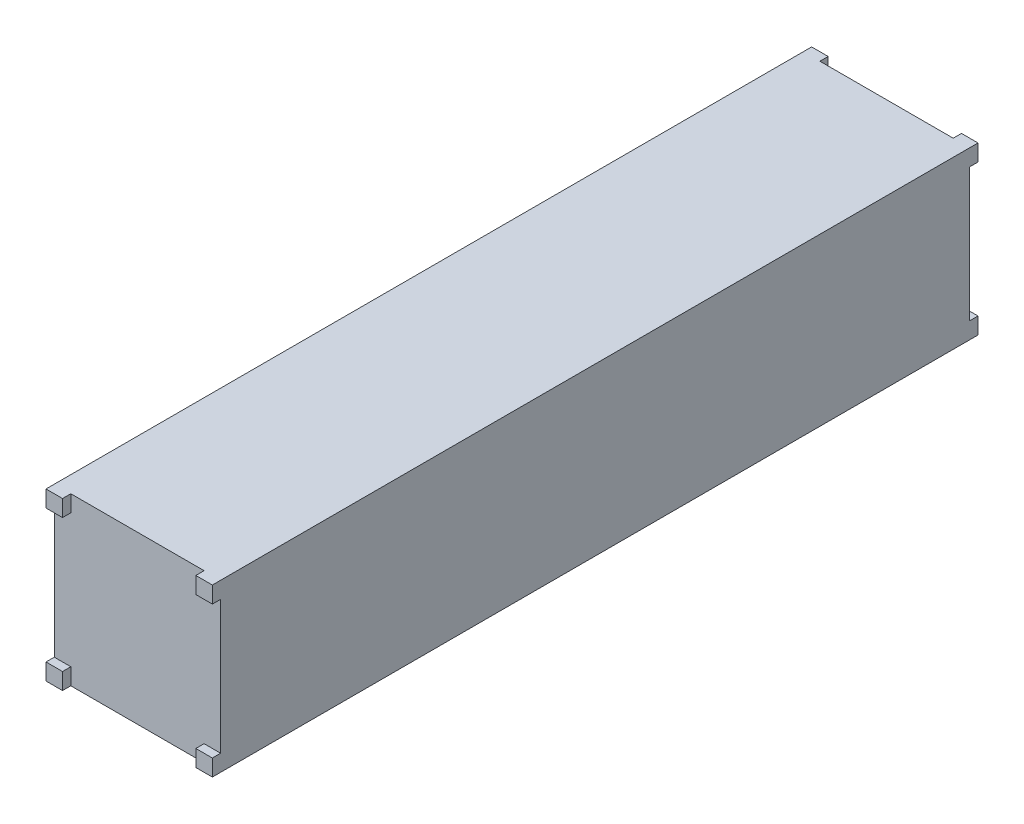
ISO-10303-21;
HEADER;
FILE_DESCRIPTION(('STEP AP214'),'2;1');
FILE_NAME('part.step','',(''),(''),'','','');
FILE_SCHEMA(('AUTOMOTIVE_DESIGN { 1 0 10303 214 1 1 1 1 }'));
ENDSEC;
DATA;
#1=APPLICATION_CONTEXT('core data for automotive mechanical design processes');
#2=APPLICATION_PROTOCOL_DEFINITION('international standard','automotive_design',2000,#1);
#3=PRODUCT_CONTEXT('',#1,'mechanical');
#4=PRODUCT('Part','Part','',(#3));
#5=PRODUCT_RELATED_PRODUCT_CATEGORY('part','',(#4));
#6=PRODUCT_DEFINITION_FORMATION('','',#4);
#7=PRODUCT_DEFINITION_CONTEXT('part definition',#1,'design');
#8=PRODUCT_DEFINITION('design','',#6,#7);
#9=PRODUCT_DEFINITION_SHAPE('','',#8);
#10=(LENGTH_UNIT() NAMED_UNIT(*) SI_UNIT(.MILLI.,.METRE.));
#11=(NAMED_UNIT(*) PLANE_ANGLE_UNIT() SI_UNIT($,.RADIAN.));
#12=(NAMED_UNIT(*) SI_UNIT($,.STERADIAN.) SOLID_ANGLE_UNIT());
#13=UNCERTAINTY_MEASURE_WITH_UNIT(LENGTH_MEASURE(1.E-05),#10,'distance_accuracy_value','');
#14=(GEOMETRIC_REPRESENTATION_CONTEXT(3) GLOBAL_UNCERTAINTY_ASSIGNED_CONTEXT((#13)) GLOBAL_UNIT_ASSIGNED_CONTEXT((#10,
#11,#12)) REPRESENTATION_CONTEXT('',''));
#15=CARTESIAN_POINT('',(0.,0.,0.));
#16=DIRECTION('',(0.,0.,1.));
#17=DIRECTION('',(1.,0.,0.));
#18=AXIS2_PLACEMENT_3D('',#15,#16,#17);
#19=CARTESIAN_POINT('',(0.,0.,-226.5));
#20=DIRECTION('',(0.,0.,1.));
#21=DIRECTION('',(1.,0.,0.));
#22=AXIS2_PLACEMENT_3D('',#19,#20,#21);
#23=PLANE('',#22);
#24=DIRECTION('',(0.,1.,0.));
#25=VECTOR('',#24,1.);
#26=CARTESIAN_POINT('',(40.3,-50.3,-226.5));
#27=LINE('',#26,#25);
#28=CARTESIAN_POINT('',(40.3,-50.3,-226.5));
#29=VERTEX_POINT('',#28);
#30=CARTESIAN_POINT('',(40.3,-40.3,-226.5));
#31=VERTEX_POINT('',#30);
#32=EDGE_CURVE('E240',#29,#31,#27,.T.);
#33=ORIENTED_EDGE('',*,*,#32,.F.);
#34=DIRECTION('',(1.,0.,0.));
#35=VECTOR('',#34,1.);
#36=CARTESIAN_POINT('',(50.3,-50.3,-226.5));
#37=LINE('',#36,#35);
#38=CARTESIAN_POINT('',(-40.2999999999999,-50.3,-226.5));
#39=VERTEX_POINT('',#38);
#40=EDGE_CURVE('E422',#39,#29,#37,.T.);
#41=ORIENTED_EDGE('',*,*,#40,.F.);
#42=DIRECTION('',(0.,-1.,0.));
#43=VECTOR('',#42,1.);
#44=CARTESIAN_POINT('',(-40.3,-50.3,-226.5));
#45=LINE('',#44,#43);
#46=CARTESIAN_POINT('',(-40.3,-40.3000000000001,-226.5));
#47=VERTEX_POINT('',#46);
#48=EDGE_CURVE('E256',#47,#39,#45,.T.);
#49=ORIENTED_EDGE('',*,*,#48,.F.);
#50=DIRECTION('',(1.,0.,0.));
#51=VECTOR('',#50,1.);
#52=CARTESIAN_POINT('',(-50.3,-40.3000000000001,-226.5));
#53=LINE('',#52,#51);
#54=CARTESIAN_POINT('',(-50.3,-40.3000000000001,-226.5));
#55=VERTEX_POINT('',#54);
#56=EDGE_CURVE('E251',#55,#47,#53,.T.);
#57=ORIENTED_EDGE('',*,*,#56,.F.);
#58=DIRECTION('',(0.,-1.,0.));
#59=VECTOR('',#58,1.);
#60=CARTESIAN_POINT('',(-50.3,-50.3,-226.5));
#61=LINE('',#60,#59);
#62=CARTESIAN_POINT('',(-50.3,40.3000000000001,-226.5));
#63=VERTEX_POINT('',#62);
#64=EDGE_CURVE('E409',#63,#55,#61,.T.);
#65=ORIENTED_EDGE('',*,*,#64,.F.);
#66=DIRECTION('',(-1.,0.,0.));
#67=VECTOR('',#66,1.);
#68=CARTESIAN_POINT('',(-50.3,40.3000000000001,-226.5));
#69=LINE('',#68,#67);
#70=CARTESIAN_POINT('',(-40.3,40.3000000000001,-226.5));
#71=VERTEX_POINT('',#70);
#72=EDGE_CURVE('E275',#71,#63,#69,.T.);
#73=ORIENTED_EDGE('',*,*,#72,.F.);
#74=DIRECTION('',(0.,-1.,0.));
#75=VECTOR('',#74,1.);
#76=CARTESIAN_POINT('',(-40.2999999999999,50.3000000000001,-226.5));
#77=LINE('',#76,#75);
#78=CARTESIAN_POINT('',(-40.2999999999999,50.3000000000001,-226.5));
#79=VERTEX_POINT('',#78);
#80=EDGE_CURVE('E270',#79,#71,#77,.T.);
#81=ORIENTED_EDGE('',*,*,#80,.F.);
#82=DIRECTION('',(-1.,0.,0.));
#83=VECTOR('',#82,1.);
#84=CARTESIAN_POINT('',(50.3,50.3,-226.5));
#85=LINE('',#84,#83);
#86=CARTESIAN_POINT('',(40.3,50.3,-226.5));
#87=VERTEX_POINT('',#86);
#88=EDGE_CURVE('E413',#87,#79,#85,.T.);
#89=ORIENTED_EDGE('',*,*,#88,.F.);
#90=DIRECTION('',(0.,1.,0.));
#91=VECTOR('',#90,1.);
#92=CARTESIAN_POINT('',(40.3,50.3,-226.5));
#93=LINE('',#92,#91);
#94=CARTESIAN_POINT('',(40.3,40.3,-226.5));
#95=VERTEX_POINT('',#94);
#96=EDGE_CURVE('E296',#95,#87,#93,.T.);
#97=ORIENTED_EDGE('',*,*,#96,.F.);
#98=DIRECTION('',(-1.,0.,0.));
#99=VECTOR('',#98,1.);
#100=CARTESIAN_POINT('',(50.3,40.3,-226.5));
#101=LINE('',#100,#99);
#102=CARTESIAN_POINT('',(50.3,40.3,-226.5));
#103=VERTEX_POINT('',#102);
#104=EDGE_CURVE('E291',#103,#95,#101,.T.);
#105=ORIENTED_EDGE('',*,*,#104,.F.);
#106=DIRECTION('',(0.,1.,0.));
#107=VECTOR('',#106,1.);
#108=CARTESIAN_POINT('',(50.3,-50.3,-226.5));
#109=LINE('',#108,#107);
#110=CARTESIAN_POINT('',(50.3,-40.3,-226.5));
#111=VERTEX_POINT('',#110);
#112=EDGE_CURVE('E424',#111,#103,#109,.T.);
#113=ORIENTED_EDGE('',*,*,#112,.F.);
#114=DIRECTION('',(1.,0.,0.));
#115=VECTOR('',#114,1.);
#116=CARTESIAN_POINT('',(50.3,-40.3,-226.5));
#117=LINE('',#116,#115);
#118=EDGE_CURVE('E238',#31,#111,#117,.T.);
#119=ORIENTED_EDGE('',*,*,#118,.F.);
#120=EDGE_LOOP('',(#33,#41,#49,#57,#65,#73,#81,#89,#97,#105,#113,#119));
#121=FACE_BOUND('',#120,.T.);
#122=ADVANCED_FACE('F33',(#121),#23,.F.);
#123=CARTESIAN_POINT('',(0.,0.,226.5));
#124=DIRECTION('',(0.,0.,1.));
#125=DIRECTION('',(1.,0.,0.));
#126=AXIS2_PLACEMENT_3D('',#123,#124,#125);
#127=PLANE('',#126);
#128=DIRECTION('',(-1.,0.,0.));
#129=VECTOR('',#128,1.);
#130=CARTESIAN_POINT('',(-50.3,-40.3,226.5));
#131=LINE('',#130,#129);
#132=CARTESIAN_POINT('',(-40.3,-40.3,226.5));
#133=VERTEX_POINT('',#132);
#134=CARTESIAN_POINT('',(-50.3,-40.3,226.5));
#135=VERTEX_POINT('',#134);
#136=EDGE_CURVE('E321',#133,#135,#131,.T.);
#137=ORIENTED_EDGE('',*,*,#136,.F.);
#138=DIRECTION('',(0.,1.,0.));
#139=VECTOR('',#138,1.);
#140=CARTESIAN_POINT('',(-40.3,-50.3,226.5));
#141=LINE('',#140,#139);
#142=CARTESIAN_POINT('',(-40.3,-50.3,226.5));
#143=VERTEX_POINT('',#142);
#144=EDGE_CURVE('E316',#143,#133,#141,.T.);
#145=ORIENTED_EDGE('',*,*,#144,.F.);
#146=DIRECTION('',(1.,0.,0.));
#147=VECTOR('',#146,1.);
#148=CARTESIAN_POINT('',(50.3,-50.3,226.5));
#149=LINE('',#148,#147);
#150=CARTESIAN_POINT('',(40.3,-50.3,226.5));
#151=VERTEX_POINT('',#150);
#152=EDGE_CURVE('E412',#143,#151,#149,.T.);
#153=ORIENTED_EDGE('',*,*,#152,.T.);
#154=DIRECTION('',(0.,-1.,0.));
#155=VECTOR('',#154,1.);
#156=CARTESIAN_POINT('',(40.3,-50.3,226.5));
#157=LINE('',#156,#155);
#158=CARTESIAN_POINT('',(40.3,-40.3,226.5));
#159=VERTEX_POINT('',#158);
#160=EDGE_CURVE('E343',#159,#151,#157,.T.);
#161=ORIENTED_EDGE('',*,*,#160,.F.);
#162=DIRECTION('',(-1.,0.,0.));
#163=VECTOR('',#162,1.);
#164=CARTESIAN_POINT('',(50.3,-40.3,226.5));
#165=LINE('',#164,#163);
#166=CARTESIAN_POINT('',(50.3,-40.3,226.5));
#167=VERTEX_POINT('',#166);
#168=EDGE_CURVE('E340',#167,#159,#165,.T.);
#169=ORIENTED_EDGE('',*,*,#168,.F.);
#170=DIRECTION('',(0.,1.,0.));
#171=VECTOR('',#170,1.);
#172=CARTESIAN_POINT('',(50.3,-50.3,226.5));
#173=LINE('',#172,#171);
#174=CARTESIAN_POINT('',(50.3,40.3,226.5));
#175=VERTEX_POINT('',#174);
#176=EDGE_CURVE('E415',#167,#175,#173,.T.);
#177=ORIENTED_EDGE('',*,*,#176,.T.);
#178=DIRECTION('',(1.,0.,0.));
#179=VECTOR('',#178,1.);
#180=CARTESIAN_POINT('',(50.3,40.3,226.5));
#181=LINE('',#180,#179);
#182=CARTESIAN_POINT('',(40.3,40.3,226.5));
#183=VERTEX_POINT('',#182);
#184=EDGE_CURVE('E367',#183,#175,#181,.T.);
#185=ORIENTED_EDGE('',*,*,#184,.F.);
#186=DIRECTION('',(0.,-1.,0.));
#187=VECTOR('',#186,1.);
#188=CARTESIAN_POINT('',(40.3,50.3,226.5));
#189=LINE('',#188,#187);
#190=CARTESIAN_POINT('',(40.3,50.3,226.5));
#191=VERTEX_POINT('',#190);
#192=EDGE_CURVE('E362',#191,#183,#189,.T.);
#193=ORIENTED_EDGE('',*,*,#192,.F.);
#194=DIRECTION('',(-1.,0.,0.));
#195=VECTOR('',#194,1.);
#196=CARTESIAN_POINT('',(50.3,50.3,226.5));
#197=LINE('',#196,#195);
#198=CARTESIAN_POINT('',(-40.2999999999999,50.3,226.5));
#199=VERTEX_POINT('',#198);
#200=EDGE_CURVE('E417',#191,#199,#197,.T.);
#201=ORIENTED_EDGE('',*,*,#200,.T.);
#202=DIRECTION('',(0.,1.,0.));
#203=VECTOR('',#202,1.);
#204=CARTESIAN_POINT('',(-40.3,50.3,226.5));
#205=LINE('',#204,#203);
#206=CARTESIAN_POINT('',(-40.3,40.3,226.5));
#207=VERTEX_POINT('',#206);
#208=EDGE_CURVE('E389',#207,#199,#205,.T.);
#209=ORIENTED_EDGE('',*,*,#208,.F.);
#210=DIRECTION('',(1.,0.,0.));
#211=VECTOR('',#210,1.);
#212=CARTESIAN_POINT('',(-50.3,40.3,226.5));
#213=LINE('',#212,#211);
#214=CARTESIAN_POINT('',(-50.3,40.3,226.5));
#215=VERTEX_POINT('',#214);
#216=EDGE_CURVE('E384',#215,#207,#213,.T.);
#217=ORIENTED_EDGE('',*,*,#216,.F.);
#218=DIRECTION('',(0.,-1.,0.));
#219=VECTOR('',#218,1.);
#220=CARTESIAN_POINT('',(-50.3,-50.3,226.5));
#221=LINE('',#220,#219);
#222=EDGE_CURVE('E410',#215,#135,#221,.T.);
#223=ORIENTED_EDGE('',*,*,#222,.T.);
#224=EDGE_LOOP('',(#137,#145,#153,#161,#169,#177,#185,#193,#201,#209,#217,#223));
#225=FACE_BOUND('',#224,.T.);
#226=ADVANCED_FACE('F484',(#225),#127,.T.);
#227=CARTESIAN_POINT('',(-50.3,-50.3,226.5));
#228=DIRECTION('',(1.,0.,0.));
#229=DIRECTION('',(0.,0.,-1.));
#230=AXIS2_PLACEMENT_3D('',#227,#228,#229);
#231=PLANE('',#230);
#232=DIRECTION('',(0.,0.,-1.));
#233=VECTOR('',#232,1.);
#234=CARTESIAN_POINT('',(-50.3,50.3,226.5));
#235=LINE('',#234,#233);
#236=CARTESIAN_POINT('',(-50.3,50.3,231.5));
#237=VERTEX_POINT('',#236);
#238=CARTESIAN_POINT('',(-50.2999999999999,50.3000000000001,-231.5));
#239=VERTEX_POINT('',#238);
#240=EDGE_CURVE('E419',#237,#239,#235,.T.);
#241=ORIENTED_EDGE('',*,*,#240,.T.);
#242=DIRECTION('',(0.,1.,0.));
#243=VECTOR('',#242,1.);
#244=CARTESIAN_POINT('',(-50.2999999999999,50.3000000000001,-231.5));
#245=LINE('',#244,#243);
#246=CARTESIAN_POINT('',(-50.3,40.3000000000001,-231.5));
#247=VERTEX_POINT('',#246);
#248=EDGE_CURVE('E271',#247,#239,#245,.T.);
#249=ORIENTED_EDGE('',*,*,#248,.F.);
#250=DIRECTION('',(0.,0.,1.));
#251=VECTOR('',#250,1.);
#252=CARTESIAN_POINT('',(-50.3,40.3000000000001,-231.5));
#253=LINE('',#252,#251);
#254=EDGE_CURVE('E281',#247,#63,#253,.T.);
#255=ORIENTED_EDGE('',*,*,#254,.T.);
#256=ORIENTED_EDGE('',*,*,#64,.T.);
#257=DIRECTION('',(0.,0.,1.));
#258=VECTOR('',#257,1.);
#259=CARTESIAN_POINT('',(-50.3,-40.3000000000001,-231.5));
#260=LINE('',#259,#258);
#261=CARTESIAN_POINT('',(-50.3,-40.3000000000001,-231.5));
#262=VERTEX_POINT('',#261);
#263=EDGE_CURVE('E268',#262,#55,#260,.T.);
#264=ORIENTED_EDGE('',*,*,#263,.F.);
#265=DIRECTION('',(0.,1.,0.));
#266=VECTOR('',#265,1.);
#267=CARTESIAN_POINT('',(-50.3,-50.3000000000001,-231.5));
#268=LINE('',#267,#266);
#269=CARTESIAN_POINT('',(-50.3,-50.3000000000001,-231.5));
#270=VERTEX_POINT('',#269);
#271=EDGE_CURVE('E255',#270,#262,#268,.T.);
#272=ORIENTED_EDGE('',*,*,#271,.F.);
#273=DIRECTION('',(0.,0.,-1.));
#274=VECTOR('',#273,1.);
#275=CARTESIAN_POINT('',(-50.3,-50.3,226.5));
#276=LINE('',#275,#274);
#277=CARTESIAN_POINT('',(-50.3,-50.3,231.5));
#278=VERTEX_POINT('',#277);
#279=EDGE_CURVE('E11',#278,#270,#276,.T.);
#280=ORIENTED_EDGE('',*,*,#279,.F.);
#281=DIRECTION('',(0.,-1.,0.));
#282=VECTOR('',#281,1.);
#283=CARTESIAN_POINT('',(-50.3,-50.3,231.5));
#284=LINE('',#283,#282);
#285=CARTESIAN_POINT('',(-50.3,-40.3,231.5));
#286=VERTEX_POINT('',#285);
#287=EDGE_CURVE('E317',#286,#278,#284,.T.);
#288=ORIENTED_EDGE('',*,*,#287,.F.);
#289=DIRECTION('',(0.,0.,-1.));
#290=VECTOR('',#289,1.);
#291=CARTESIAN_POINT('',(-50.3,-40.3,231.5));
#292=LINE('',#291,#290);
#293=EDGE_CURVE('E327',#286,#135,#292,.T.);
#294=ORIENTED_EDGE('',*,*,#293,.T.);
#295=ORIENTED_EDGE('',*,*,#222,.F.);
#296=DIRECTION('',(0.,0.,-1.));
#297=VECTOR('',#296,1.);
#298=CARTESIAN_POINT('',(-50.3,40.3,231.5));
#299=LINE('',#298,#297);
#300=CARTESIAN_POINT('',(-50.3,40.3,231.5));
#301=VERTEX_POINT('',#300);
#302=EDGE_CURVE('E406',#301,#215,#299,.T.);
#303=ORIENTED_EDGE('',*,*,#302,.F.);
#304=DIRECTION('',(0.,-1.,0.));
#305=VECTOR('',#304,1.);
#306=CARTESIAN_POINT('',(-50.3,50.3,231.5));
#307=LINE('',#306,#305);
#308=EDGE_CURVE('E385',#237,#301,#307,.T.);
#309=ORIENTED_EDGE('',*,*,#308,.F.);
#310=EDGE_LOOP('',(#241,#249,#255,#256,#264,#272,#280,#288,#294,#295,#303,#309));
#311=FACE_BOUND('',#310,.T.);
#312=ADVANCED_FACE('F35',(#311),#231,.F.);
#313=CARTESIAN_POINT('',(50.3,-50.3,226.5));
#314=DIRECTION('',(0.,1.,0.));
#315=DIRECTION('',(0.,0.,1.));
#316=AXIS2_PLACEMENT_3D('',#313,#314,#315);
#317=PLANE('',#316);
#318=ORIENTED_EDGE('',*,*,#279,.T.);
#319=DIRECTION('',(-1.,0.,0.));
#320=VECTOR('',#319,1.);
#321=CARTESIAN_POINT('',(-50.3,-50.3000000000001,-231.5));
#322=LINE('',#321,#320);
#323=CARTESIAN_POINT('',(-40.3,-50.3,-231.5));
#324=VERTEX_POINT('',#323);
#325=EDGE_CURVE('E252',#324,#270,#322,.T.);
#326=ORIENTED_EDGE('',*,*,#325,.F.);
#327=DIRECTION('',(0.,0.,1.));
#328=VECTOR('',#327,1.);
#329=CARTESIAN_POINT('',(-40.3,-50.3,-231.5));
#330=LINE('',#329,#328);
#331=EDGE_CURVE('E56',#324,#39,#330,.T.);
#332=ORIENTED_EDGE('',*,*,#331,.T.);
#333=ORIENTED_EDGE('',*,*,#40,.T.);
#334=DIRECTION('',(0.,0.,1.));
#335=VECTOR('',#334,1.);
#336=CARTESIAN_POINT('',(40.3,-50.3,-231.5));
#337=LINE('',#336,#335);
#338=CARTESIAN_POINT('',(40.3,-50.3,-231.5));
#339=VERTEX_POINT('',#338);
#340=EDGE_CURVE('E230',#339,#29,#337,.T.);
#341=ORIENTED_EDGE('',*,*,#340,.F.);
#342=DIRECTION('',(-1.,0.,0.));
#343=VECTOR('',#342,1.);
#344=CARTESIAN_POINT('',(50.3,-50.3,-231.5));
#345=LINE('',#344,#343);
#346=CARTESIAN_POINT('',(50.3,-50.3,-231.5));
#347=VERTEX_POINT('',#346);
#348=EDGE_CURVE('E228',#347,#339,#345,.T.);
#349=ORIENTED_EDGE('',*,*,#348,.F.);
#350=DIRECTION('',(0.,0.,-1.));
#351=VECTOR('',#350,1.);
#352=CARTESIAN_POINT('',(50.3,-50.3,226.5));
#353=LINE('',#352,#351);
#354=CARTESIAN_POINT('',(50.3,-50.3,231.5));
#355=VERTEX_POINT('',#354);
#356=EDGE_CURVE('E41',#355,#347,#353,.T.);
#357=ORIENTED_EDGE('',*,*,#356,.F.);
#358=DIRECTION('',(1.,0.,0.));
#359=VECTOR('',#358,1.);
#360=CARTESIAN_POINT('',(50.3,-50.3,231.5));
#361=LINE('',#360,#359);
#362=CARTESIAN_POINT('',(40.3,-50.3,231.5));
#363=VERTEX_POINT('',#362);
#364=EDGE_CURVE('E341',#363,#355,#361,.T.);
#365=ORIENTED_EDGE('',*,*,#364,.F.);
#366=DIRECTION('',(0.,0.,-1.));
#367=VECTOR('',#366,1.);
#368=CARTESIAN_POINT('',(40.3,-50.3,231.5));
#369=LINE('',#368,#367);
#370=EDGE_CURVE('E349',#363,#151,#369,.T.);
#371=ORIENTED_EDGE('',*,*,#370,.T.);
#372=ORIENTED_EDGE('',*,*,#152,.F.);
#373=DIRECTION('',(0.,0.,-1.));
#374=VECTOR('',#373,1.);
#375=CARTESIAN_POINT('',(-40.3,-50.3,231.5));
#376=LINE('',#375,#374);
#377=CARTESIAN_POINT('',(-40.3,-50.3,231.5));
#378=VERTEX_POINT('',#377);
#379=EDGE_CURVE('E337',#378,#143,#376,.T.);
#380=ORIENTED_EDGE('',*,*,#379,.F.);
#381=DIRECTION('',(1.,0.,0.));
#382=VECTOR('',#381,1.);
#383=CARTESIAN_POINT('',(-50.3,-50.3,231.5));
#384=LINE('',#383,#382);
#385=EDGE_CURVE('E320',#278,#378,#384,.T.);
#386=ORIENTED_EDGE('',*,*,#385,.F.);
#387=EDGE_LOOP('',(#318,#326,#332,#333,#341,#349,#357,#365,#371,#372,#380,#386));
#388=FACE_BOUND('',#387,.T.);
#389=ADVANCED_FACE('F229',(#388),#317,.F.);
#390=CARTESIAN_POINT('',(50.3,-50.3,226.5));
#391=DIRECTION('',(-1.,0.,0.));
#392=DIRECTION('',(0.,0.,1.));
#393=AXIS2_PLACEMENT_3D('',#390,#391,#392);
#394=PLANE('',#393);
#395=ORIENTED_EDGE('',*,*,#356,.T.);
#396=DIRECTION('',(0.,-1.,0.));
#397=VECTOR('',#396,1.);
#398=CARTESIAN_POINT('',(50.3,-50.3,-231.5));
#399=LINE('',#398,#397);
#400=CARTESIAN_POINT('',(50.3,-40.3,-231.5));
#401=VERTEX_POINT('',#400);
#402=EDGE_CURVE('E221',#401,#347,#399,.T.);
#403=ORIENTED_EDGE('',*,*,#402,.F.);
#404=DIRECTION('',(0.,0.,1.));
#405=VECTOR('',#404,1.);
#406=CARTESIAN_POINT('',(50.3,-40.3,-231.5));
#407=LINE('',#406,#405);
#408=EDGE_CURVE('E48',#401,#111,#407,.T.);
#409=ORIENTED_EDGE('',*,*,#408,.T.);
#410=ORIENTED_EDGE('',*,*,#112,.T.);
#411=DIRECTION('',(0.,0.,1.));
#412=VECTOR('',#411,1.);
#413=CARTESIAN_POINT('',(50.3,40.3,-231.5));
#414=LINE('',#413,#412);
#415=CARTESIAN_POINT('',(50.3,40.3,-231.5));
#416=VERTEX_POINT('',#415);
#417=EDGE_CURVE('E313',#416,#103,#414,.T.);
#418=ORIENTED_EDGE('',*,*,#417,.F.);
#419=DIRECTION('',(0.,-1.,0.));
#420=VECTOR('',#419,1.);
#421=CARTESIAN_POINT('',(50.3,50.3,-231.5));
#422=LINE('',#421,#420);
#423=CARTESIAN_POINT('',(50.3,50.3,-231.5));
#424=VERTEX_POINT('',#423);
#425=EDGE_CURVE('E292',#424,#416,#422,.T.);
#426=ORIENTED_EDGE('',*,*,#425,.F.);
#427=DIRECTION('',(0.,0.,-1.));
#428=VECTOR('',#427,1.);
#429=CARTESIAN_POINT('',(50.3,50.3,226.5));
#430=LINE('',#429,#428);
#431=CARTESIAN_POINT('',(50.3,50.3,231.5));
#432=VERTEX_POINT('',#431);
#433=EDGE_CURVE('E226',#432,#424,#430,.T.);
#434=ORIENTED_EDGE('',*,*,#433,.F.);
#435=DIRECTION('',(0.,1.,0.));
#436=VECTOR('',#435,1.);
#437=CARTESIAN_POINT('',(50.3,50.3,231.5));
#438=LINE('',#437,#436);
#439=CARTESIAN_POINT('',(50.3,40.3,231.5));
#440=VERTEX_POINT('',#439);
#441=EDGE_CURVE('E363',#440,#432,#438,.T.);
#442=ORIENTED_EDGE('',*,*,#441,.F.);
#443=DIRECTION('',(0.,0.,-1.));
#444=VECTOR('',#443,1.);
#445=CARTESIAN_POINT('',(50.3,40.3,231.5));
#446=LINE('',#445,#444);
#447=EDGE_CURVE('E373',#440,#175,#446,.T.);
#448=ORIENTED_EDGE('',*,*,#447,.T.);
#449=ORIENTED_EDGE('',*,*,#176,.F.);
#450=DIRECTION('',(0.,0.,-1.));
#451=VECTOR('',#450,1.);
#452=CARTESIAN_POINT('',(50.3,-40.3,231.5));
#453=LINE('',#452,#451);
#454=CARTESIAN_POINT('',(50.3,-40.3,231.5));
#455=VERTEX_POINT('',#454);
#456=EDGE_CURVE('E359',#455,#167,#453,.T.);
#457=ORIENTED_EDGE('',*,*,#456,.F.);
#458=DIRECTION('',(0.,1.,0.));
#459=VECTOR('',#458,1.);
#460=CARTESIAN_POINT('',(50.3,-50.3,231.5));
#461=LINE('',#460,#459);
#462=EDGE_CURVE('E223',#355,#455,#461,.T.);
#463=ORIENTED_EDGE('',*,*,#462,.F.);
#464=EDGE_LOOP('',(#395,#403,#409,#410,#418,#426,#434,#442,#448,#449,#457,#463));
#465=FACE_BOUND('',#464,.T.);
#466=ADVANCED_FACE('F219',(#465),#394,.F.);
#467=CARTESIAN_POINT('',(50.3,50.3,226.5));
#468=DIRECTION('',(0.,-1.,0.));
#469=DIRECTION('',(1.,0.,0.));
#470=AXIS2_PLACEMENT_3D('',#467,#468,#469);
#471=PLANE('',#470);
#472=ORIENTED_EDGE('',*,*,#433,.T.);
#473=DIRECTION('',(1.,0.,0.));
#474=VECTOR('',#473,1.);
#475=CARTESIAN_POINT('',(50.3,50.3,-231.5));
#476=LINE('',#475,#474);
#477=CARTESIAN_POINT('',(40.3,50.3,-231.5));
#478=VERTEX_POINT('',#477);
#479=EDGE_CURVE('E300',#478,#424,#476,.T.);
#480=ORIENTED_EDGE('',*,*,#479,.F.);
#481=DIRECTION('',(0.,0.,1.));
#482=VECTOR('',#481,1.);
#483=CARTESIAN_POINT('',(40.3,50.3,-231.5));
#484=LINE('',#483,#482);
#485=EDGE_CURVE('E303',#478,#87,#484,.T.);
#486=ORIENTED_EDGE('',*,*,#485,.T.);
#487=ORIENTED_EDGE('',*,*,#88,.T.);
#488=DIRECTION('',(0.,0.,1.));
#489=VECTOR('',#488,1.);
#490=CARTESIAN_POINT('',(-40.2999999999999,50.3000000000001,-231.5));
#491=LINE('',#490,#489);
#492=CARTESIAN_POINT('',(-40.2999999999999,50.3000000000001,-231.5));
#493=VERTEX_POINT('',#492);
#494=EDGE_CURVE('E289',#493,#79,#491,.T.);
#495=ORIENTED_EDGE('',*,*,#494,.F.);
#496=DIRECTION('',(1.,0.,0.));
#497=VECTOR('',#496,1.);
#498=CARTESIAN_POINT('',(-50.2999999999999,50.3000000000001,-231.5));
#499=LINE('',#498,#497);
#500=EDGE_CURVE('E274',#239,#493,#499,.T.);
#501=ORIENTED_EDGE('',*,*,#500,.F.);
#502=ORIENTED_EDGE('',*,*,#240,.F.);
#503=DIRECTION('',(-1.,0.,0.));
#504=VECTOR('',#503,1.);
#505=CARTESIAN_POINT('',(-50.3,50.3,231.5));
#506=LINE('',#505,#504);
#507=CARTESIAN_POINT('',(-40.3,50.3,231.5));
#508=VERTEX_POINT('',#507);
#509=EDGE_CURVE('E393',#508,#237,#506,.T.);
#510=ORIENTED_EDGE('',*,*,#509,.F.);
#511=DIRECTION('',(0.,0.,-1.));
#512=VECTOR('',#511,1.);
#513=CARTESIAN_POINT('',(-40.3,50.3,231.5));
#514=LINE('',#513,#512);
#515=EDGE_CURVE('E396',#508,#199,#514,.T.);
#516=ORIENTED_EDGE('',*,*,#515,.T.);
#517=ORIENTED_EDGE('',*,*,#200,.F.);
#518=DIRECTION('',(0.,0.,-1.));
#519=VECTOR('',#518,1.);
#520=CARTESIAN_POINT('',(40.3,50.3,231.5));
#521=LINE('',#520,#519);
#522=CARTESIAN_POINT('',(40.3,50.3,231.5));
#523=VERTEX_POINT('',#522);
#524=EDGE_CURVE('E382',#523,#191,#521,.T.);
#525=ORIENTED_EDGE('',*,*,#524,.F.);
#526=DIRECTION('',(-1.,0.,0.));
#527=VECTOR('',#526,1.);
#528=CARTESIAN_POINT('',(50.3,50.3,231.5));
#529=LINE('',#528,#527);
#530=EDGE_CURVE('E366',#432,#523,#529,.T.);
#531=ORIENTED_EDGE('',*,*,#530,.F.);
#532=EDGE_LOOP('',(#472,#480,#486,#487,#495,#501,#502,#510,#516,#517,#525,#531));
#533=FACE_BOUND('',#532,.T.);
#534=ADVANCED_FACE('F432',(#533),#471,.F.);
#535=CARTESIAN_POINT('',(-50.3,40.3,231.5));
#536=DIRECTION('',(0.,1.,0.));
#537=DIRECTION('',(0.,0.,1.));
#538=AXIS2_PLACEMENT_3D('',#535,#536,#537);
#539=PLANE('',#538);
#540=ORIENTED_EDGE('',*,*,#216,.T.);
#541=DIRECTION('',(0.,0.,-1.));
#542=VECTOR('',#541,1.);
#543=CARTESIAN_POINT('',(-40.3,40.3,231.5));
#544=LINE('',#543,#542);
#545=CARTESIAN_POINT('',(-40.3,40.3,231.5));
#546=VERTEX_POINT('',#545);
#547=EDGE_CURVE('E403',#546,#207,#544,.T.);
#548=ORIENTED_EDGE('',*,*,#547,.F.);
#549=DIRECTION('',(1.,0.,0.));
#550=VECTOR('',#549,1.);
#551=CARTESIAN_POINT('',(-50.3,40.3,231.5));
#552=LINE('',#551,#550);
#553=EDGE_CURVE('E388',#301,#546,#552,.T.);
#554=ORIENTED_EDGE('',*,*,#553,.F.);
#555=ORIENTED_EDGE('',*,*,#302,.T.);
#556=EDGE_LOOP('',(#540,#548,#554,#555));
#557=FACE_BOUND('',#556,.T.);
#558=ADVANCED_FACE('F476',(#557),#539,.F.);
#559=CARTESIAN_POINT('',(-40.3,50.3,231.5));
#560=DIRECTION('',(-1.,0.,0.));
#561=DIRECTION('',(0.,0.,1.));
#562=AXIS2_PLACEMENT_3D('',#559,#560,#561);
#563=PLANE('',#562);
#564=ORIENTED_EDGE('',*,*,#208,.T.);
#565=ORIENTED_EDGE('',*,*,#515,.F.);
#566=DIRECTION('',(0.,1.,0.));
#567=VECTOR('',#566,1.);
#568=CARTESIAN_POINT('',(-40.3,50.3,231.5));
#569=LINE('',#568,#567);
#570=EDGE_CURVE('E391',#546,#508,#569,.T.);
#571=ORIENTED_EDGE('',*,*,#570,.F.);
#572=ORIENTED_EDGE('',*,*,#547,.T.);
#573=EDGE_LOOP('',(#564,#565,#571,#572));
#574=FACE_BOUND('',#573,.T.);
#575=ADVANCED_FACE('F479',(#574),#563,.F.);
#576=CARTESIAN_POINT('',(0.,0.,231.5));
#577=DIRECTION('',(0.,0.,1.));
#578=DIRECTION('',(1.,0.,0.));
#579=AXIS2_PLACEMENT_3D('',#576,#577,#578);
#580=PLANE('',#579);
#581=ORIENTED_EDGE('',*,*,#308,.T.);
#582=ORIENTED_EDGE('',*,*,#553,.T.);
#583=ORIENTED_EDGE('',*,*,#570,.T.);
#584=ORIENTED_EDGE('',*,*,#509,.T.);
#585=EDGE_LOOP('',(#581,#582,#583,#584));
#586=FACE_BOUND('',#585,.T.);
#587=ADVANCED_FACE('F470',(#586),#580,.T.);
#588=CARTESIAN_POINT('',(40.3,50.3,231.5));
#589=DIRECTION('',(1.,0.,0.));
#590=DIRECTION('',(0.,0.,-1.));
#591=AXIS2_PLACEMENT_3D('',#588,#589,#590);
#592=PLANE('',#591);
#593=ORIENTED_EDGE('',*,*,#192,.T.);
#594=DIRECTION('',(0.,0.,-1.));
#595=VECTOR('',#594,1.);
#596=CARTESIAN_POINT('',(40.3,40.3,231.5));
#597=LINE('',#596,#595);
#598=CARTESIAN_POINT('',(40.3,40.3,231.5));
#599=VERTEX_POINT('',#598);
#600=EDGE_CURVE('E380',#599,#183,#597,.T.);
#601=ORIENTED_EDGE('',*,*,#600,.F.);
#602=DIRECTION('',(0.,-1.,0.));
#603=VECTOR('',#602,1.);
#604=CARTESIAN_POINT('',(40.3,50.3,231.5));
#605=LINE('',#604,#603);
#606=EDGE_CURVE('E369',#523,#599,#605,.T.);
#607=ORIENTED_EDGE('',*,*,#606,.F.);
#608=ORIENTED_EDGE('',*,*,#524,.T.);
#609=EDGE_LOOP('',(#593,#601,#607,#608));
#610=FACE_BOUND('',#609,.T.);
#611=ADVANCED_FACE('F488',(#610),#592,.F.);
#612=CARTESIAN_POINT('',(50.3,40.3,231.5));
#613=DIRECTION('',(0.,1.,0.));
#614=DIRECTION('',(-1.,0.,0.));
#615=AXIS2_PLACEMENT_3D('',#612,#613,#614);
#616=PLANE('',#615);
#617=ORIENTED_EDGE('',*,*,#184,.T.);
#618=ORIENTED_EDGE('',*,*,#447,.F.);
#619=DIRECTION('',(1.,0.,0.));
#620=VECTOR('',#619,1.);
#621=CARTESIAN_POINT('',(50.3,40.3,231.5));
#622=LINE('',#621,#620);
#623=EDGE_CURVE('E371',#599,#440,#622,.T.);
#624=ORIENTED_EDGE('',*,*,#623,.F.);
#625=ORIENTED_EDGE('',*,*,#600,.T.);
#626=EDGE_LOOP('',(#617,#618,#624,#625));
#627=FACE_BOUND('',#626,.T.);
#628=ADVANCED_FACE('F495',(#627),#616,.F.);
#629=CARTESIAN_POINT('',(0.,0.,231.5));
#630=DIRECTION('',(0.,0.,-1.));
#631=DIRECTION('',(-1.,0.,0.));
#632=AXIS2_PLACEMENT_3D('',#629,#630,#631);
#633=PLANE('',#632);
#634=ORIENTED_EDGE('',*,*,#441,.T.);
#635=ORIENTED_EDGE('',*,*,#530,.T.);
#636=ORIENTED_EDGE('',*,*,#606,.T.);
#637=ORIENTED_EDGE('',*,*,#623,.T.);
#638=EDGE_LOOP('',(#634,#635,#636,#637));
#639=FACE_BOUND('',#638,.T.);
#640=ADVANCED_FACE('F491',(#639),#633,.F.);
#641=CARTESIAN_POINT('',(50.3,-40.3,231.5));
#642=DIRECTION('',(0.,-1.,0.));
#643=DIRECTION('',(1.,0.,0.));
#644=AXIS2_PLACEMENT_3D('',#641,#642,#643);
#645=PLANE('',#644);
#646=ORIENTED_EDGE('',*,*,#168,.T.);
#647=DIRECTION('',(0.,0.,-1.));
#648=VECTOR('',#647,1.);
#649=CARTESIAN_POINT('',(40.3,-40.3,231.5));
#650=LINE('',#649,#648);
#651=CARTESIAN_POINT('',(40.3,-40.3,231.5));
#652=VERTEX_POINT('',#651);
#653=EDGE_CURVE('E356',#652,#159,#650,.T.);
#654=ORIENTED_EDGE('',*,*,#653,.F.);
#655=DIRECTION('',(-1.,0.,0.));
#656=VECTOR('',#655,1.);
#657=CARTESIAN_POINT('',(50.3,-40.3,231.5));
#658=LINE('',#657,#656);
#659=EDGE_CURVE('E345',#455,#652,#658,.T.);
#660=ORIENTED_EDGE('',*,*,#659,.F.);
#661=ORIENTED_EDGE('',*,*,#456,.T.);
#662=EDGE_LOOP('',(#646,#654,#660,#661));
#663=FACE_BOUND('',#662,.T.);
#664=ADVANCED_FACE('F502',(#663),#645,.F.);
#665=CARTESIAN_POINT('',(40.3,-50.3,231.5));
#666=DIRECTION('',(1.,0.,0.));
#667=DIRECTION('',(0.,0.,-1.));
#668=AXIS2_PLACEMENT_3D('',#665,#666,#667);
#669=PLANE('',#668);
#670=ORIENTED_EDGE('',*,*,#160,.T.);
#671=ORIENTED_EDGE('',*,*,#370,.F.);
#672=DIRECTION('',(0.,-1.,0.));
#673=VECTOR('',#672,1.);
#674=CARTESIAN_POINT('',(40.3,-50.3,231.5));
#675=LINE('',#674,#673);
#676=EDGE_CURVE('E347',#652,#363,#675,.T.);
#677=ORIENTED_EDGE('',*,*,#676,.F.);
#678=ORIENTED_EDGE('',*,*,#653,.T.);
#679=EDGE_LOOP('',(#670,#671,#677,#678));
#680=FACE_BOUND('',#679,.T.);
#681=ADVANCED_FACE('F577',(#680),#669,.F.);
#682=CARTESIAN_POINT('',(0.,0.,231.5));
#683=DIRECTION('',(0.,0.,-1.));
#684=DIRECTION('',(-1.,0.,0.));
#685=AXIS2_PLACEMENT_3D('',#682,#683,#684);
#686=PLANE('',#685);
#687=ORIENTED_EDGE('',*,*,#364,.T.);
#688=ORIENTED_EDGE('',*,*,#462,.T.);
#689=ORIENTED_EDGE('',*,*,#659,.T.);
#690=ORIENTED_EDGE('',*,*,#676,.T.);
#691=EDGE_LOOP('',(#687,#688,#689,#690));
#692=FACE_BOUND('',#691,.T.);
#693=ADVANCED_FACE('F587',(#692),#686,.F.);
#694=CARTESIAN_POINT('',(-40.3,-50.3,231.5));
#695=DIRECTION('',(-1.,0.,0.));
#696=DIRECTION('',(0.,0.,1.));
#697=AXIS2_PLACEMENT_3D('',#694,#695,#696);
#698=PLANE('',#697);
#699=ORIENTED_EDGE('',*,*,#144,.T.);
#700=DIRECTION('',(0.,0.,-1.));
#701=VECTOR('',#700,1.);
#702=CARTESIAN_POINT('',(-40.3,-40.3,231.5));
#703=LINE('',#702,#701);
#704=CARTESIAN_POINT('',(-40.3,-40.3,231.5));
#705=VERTEX_POINT('',#704);
#706=EDGE_CURVE('E334',#705,#133,#703,.T.);
#707=ORIENTED_EDGE('',*,*,#706,.F.);
#708=DIRECTION('',(0.,1.,0.));
#709=VECTOR('',#708,1.);
#710=CARTESIAN_POINT('',(-40.3,-50.3,231.5));
#711=LINE('',#710,#709);
#712=EDGE_CURVE('E323',#378,#705,#711,.T.);
#713=ORIENTED_EDGE('',*,*,#712,.F.);
#714=ORIENTED_EDGE('',*,*,#379,.T.);
#715=EDGE_LOOP('',(#699,#707,#713,#714));
#716=FACE_BOUND('',#715,.T.);
#717=ADVANCED_FACE('F597',(#716),#698,.F.);
#718=CARTESIAN_POINT('',(-50.3,-40.3,231.5));
#719=DIRECTION('',(0.,-1.,0.));
#720=DIRECTION('',(0.,0.,-1.));
#721=AXIS2_PLACEMENT_3D('',#718,#719,#720);
#722=PLANE('',#721);
#723=ORIENTED_EDGE('',*,*,#136,.T.);
#724=ORIENTED_EDGE('',*,*,#293,.F.);
#725=DIRECTION('',(-1.,0.,0.));
#726=VECTOR('',#725,1.);
#727=CARTESIAN_POINT('',(-50.3,-40.3,231.5));
#728=LINE('',#727,#726);
#729=EDGE_CURVE('E325',#705,#286,#728,.T.);
#730=ORIENTED_EDGE('',*,*,#729,.F.);
#731=ORIENTED_EDGE('',*,*,#706,.T.);
#732=EDGE_LOOP('',(#723,#724,#730,#731));
#733=FACE_BOUND('',#732,.T.);
#734=ADVANCED_FACE('F607',(#733),#722,.F.);
#735=CARTESIAN_POINT('',(0.,0.,231.5));
#736=DIRECTION('',(0.,0.,-1.));
#737=DIRECTION('',(-1.,0.,0.));
#738=AXIS2_PLACEMENT_3D('',#735,#736,#737);
#739=PLANE('',#738);
#740=ORIENTED_EDGE('',*,*,#287,.T.);
#741=ORIENTED_EDGE('',*,*,#385,.T.);
#742=ORIENTED_EDGE('',*,*,#712,.T.);
#743=ORIENTED_EDGE('',*,*,#729,.T.);
#744=EDGE_LOOP('',(#740,#741,#742,#743));
#745=FACE_BOUND('',#744,.T.);
#746=ADVANCED_FACE('F617',(#745),#739,.F.);
#747=CARTESIAN_POINT('',(50.3,40.3,-231.5));
#748=DIRECTION('',(0.,1.,0.));
#749=DIRECTION('',(0.,0.,1.));
#750=AXIS2_PLACEMENT_3D('',#747,#748,#749);
#751=PLANE('',#750);
#752=ORIENTED_EDGE('',*,*,#104,.T.);
#753=DIRECTION('',(0.,0.,1.));
#754=VECTOR('',#753,1.);
#755=CARTESIAN_POINT('',(40.3,40.3,-231.5));
#756=LINE('',#755,#754);
#757=CARTESIAN_POINT('',(40.3,40.3,-231.5));
#758=VERTEX_POINT('',#757);
#759=EDGE_CURVE('E310',#758,#95,#756,.T.);
#760=ORIENTED_EDGE('',*,*,#759,.F.);
#761=DIRECTION('',(-1.,0.,0.));
#762=VECTOR('',#761,1.);
#763=CARTESIAN_POINT('',(50.3,40.3,-231.5));
#764=LINE('',#763,#762);
#765=EDGE_CURVE('E295',#416,#758,#764,.T.);
#766=ORIENTED_EDGE('',*,*,#765,.F.);
#767=ORIENTED_EDGE('',*,*,#417,.T.);
#768=EDGE_LOOP('',(#752,#760,#766,#767));
#769=FACE_BOUND('',#768,.T.);
#770=ADVANCED_FACE('F444',(#769),#751,.F.);
#771=CARTESIAN_POINT('',(40.3,50.3,-231.5));
#772=DIRECTION('',(1.,0.,0.));
#773=DIRECTION('',(0.,0.,-1.));
#774=AXIS2_PLACEMENT_3D('',#771,#772,#773);
#775=PLANE('',#774);
#776=ORIENTED_EDGE('',*,*,#96,.T.);
#777=ORIENTED_EDGE('',*,*,#485,.F.);
#778=DIRECTION('',(0.,1.,0.));
#779=VECTOR('',#778,1.);
#780=CARTESIAN_POINT('',(40.3,50.3,-231.5));
#781=LINE('',#780,#779);
#782=EDGE_CURVE('E298',#758,#478,#781,.T.);
#783=ORIENTED_EDGE('',*,*,#782,.F.);
#784=ORIENTED_EDGE('',*,*,#759,.T.);
#785=EDGE_LOOP('',(#776,#777,#783,#784));
#786=FACE_BOUND('',#785,.T.);
#787=ADVANCED_FACE('F447',(#786),#775,.F.);
#788=CARTESIAN_POINT('',(0.,0.,-231.5));
#789=DIRECTION('',(0.,0.,-1.));
#790=DIRECTION('',(-1.,0.,0.));
#791=AXIS2_PLACEMENT_3D('',#788,#789,#790);
#792=PLANE('',#791);
#793=ORIENTED_EDGE('',*,*,#425,.T.);
#794=ORIENTED_EDGE('',*,*,#765,.T.);
#795=ORIENTED_EDGE('',*,*,#782,.T.);
#796=ORIENTED_EDGE('',*,*,#479,.T.);
#797=EDGE_LOOP('',(#793,#794,#795,#796));
#798=FACE_BOUND('',#797,.T.);
#799=ADVANCED_FACE('F437',(#798),#792,.T.);
#800=CARTESIAN_POINT('',(-40.2999999999999,50.3000000000001,-231.5));
#801=DIRECTION('',(-1.,0.,0.));
#802=DIRECTION('',(0.,-1.,0.));
#803=AXIS2_PLACEMENT_3D('',#800,#801,#802);
#804=PLANE('',#803);
#805=ORIENTED_EDGE('',*,*,#80,.T.);
#806=DIRECTION('',(0.,0.,1.));
#807=VECTOR('',#806,1.);
#808=CARTESIAN_POINT('',(-40.3,40.3000000000001,-231.5));
#809=LINE('',#808,#807);
#810=CARTESIAN_POINT('',(-40.3,40.3000000000001,-231.5));
#811=VERTEX_POINT('',#810);
#812=EDGE_CURVE('E286',#811,#71,#809,.T.);
#813=ORIENTED_EDGE('',*,*,#812,.F.);
#814=DIRECTION('',(0.,-1.,0.));
#815=VECTOR('',#814,1.);
#816=CARTESIAN_POINT('',(-40.2999999999999,50.3000000000001,-231.5));
#817=LINE('',#816,#815);
#818=EDGE_CURVE('E277',#493,#811,#817,.T.);
#819=ORIENTED_EDGE('',*,*,#818,.F.);
#820=ORIENTED_EDGE('',*,*,#494,.T.);
#821=EDGE_LOOP('',(#805,#813,#819,#820));
#822=FACE_BOUND('',#821,.T.);
#823=ADVANCED_FACE('F458',(#822),#804,.F.);
#824=CARTESIAN_POINT('',(-50.3,40.3000000000001,-231.5));
#825=DIRECTION('',(0.,1.,0.));
#826=DIRECTION('',(-1.,0.,0.));
#827=AXIS2_PLACEMENT_3D('',#824,#825,#826);
#828=PLANE('',#827);
#829=ORIENTED_EDGE('',*,*,#72,.T.);
#830=ORIENTED_EDGE('',*,*,#254,.F.);
#831=DIRECTION('',(-1.,0.,0.));
#832=VECTOR('',#831,1.);
#833=CARTESIAN_POINT('',(-50.3,40.3000000000001,-231.5));
#834=LINE('',#833,#832);
#835=EDGE_CURVE('E279',#811,#247,#834,.T.);
#836=ORIENTED_EDGE('',*,*,#835,.F.);
#837=ORIENTED_EDGE('',*,*,#812,.T.);
#838=EDGE_LOOP('',(#829,#830,#836,#837));
#839=FACE_BOUND('',#838,.T.);
#840=ADVANCED_FACE('F461',(#839),#828,.F.);
#841=CARTESIAN_POINT('',(0.,0.,-231.5));
#842=DIRECTION('',(0.,0.,1.));
#843=DIRECTION('',(1.,0.,0.));
#844=AXIS2_PLACEMENT_3D('',#841,#842,#843);
#845=PLANE('',#844);
#846=ORIENTED_EDGE('',*,*,#248,.T.);
#847=ORIENTED_EDGE('',*,*,#500,.T.);
#848=ORIENTED_EDGE('',*,*,#818,.T.);
#849=ORIENTED_EDGE('',*,*,#835,.T.);
#850=EDGE_LOOP('',(#846,#847,#848,#849));
#851=FACE_BOUND('',#850,.T.);
#852=ADVANCED_FACE('F465',(#851),#845,.F.);
#853=CARTESIAN_POINT('',(-50.3,-40.3000000000001,-231.5));
#854=DIRECTION('',(0.,-1.,0.));
#855=DIRECTION('',(1.,0.,0.));
#856=AXIS2_PLACEMENT_3D('',#853,#854,#855);
#857=PLANE('',#856);
#858=ORIENTED_EDGE('',*,*,#56,.T.);
#859=DIRECTION('',(0.,0.,1.));
#860=VECTOR('',#859,1.);
#861=CARTESIAN_POINT('',(-40.3,-40.3000000000001,-231.5));
#862=LINE('',#861,#860);
#863=CARTESIAN_POINT('',(-40.3,-40.3000000000001,-231.5));
#864=VERTEX_POINT('',#863);
#865=EDGE_CURVE('E265',#864,#47,#862,.T.);
#866=ORIENTED_EDGE('',*,*,#865,.F.);
#867=DIRECTION('',(1.,0.,0.));
#868=VECTOR('',#867,1.);
#869=CARTESIAN_POINT('',(-50.3,-40.3000000000001,-231.5));
#870=LINE('',#869,#868);
#871=EDGE_CURVE('E258',#262,#864,#870,.T.);
#872=ORIENTED_EDGE('',*,*,#871,.F.);
#873=ORIENTED_EDGE('',*,*,#263,.T.);
#874=EDGE_LOOP('',(#858,#866,#872,#873));
#875=FACE_BOUND('',#874,.T.);
#876=ADVANCED_FACE('F718',(#875),#857,.F.);
#877=CARTESIAN_POINT('',(-40.3,-50.3,-231.5));
#878=DIRECTION('',(-1.,0.,0.));
#879=DIRECTION('',(0.,-1.,0.));
#880=AXIS2_PLACEMENT_3D('',#877,#878,#879);
#881=PLANE('',#880);
#882=ORIENTED_EDGE('',*,*,#48,.T.);
#883=ORIENTED_EDGE('',*,*,#331,.F.);
#884=DIRECTION('',(0.,-1.,0.));
#885=VECTOR('',#884,1.);
#886=CARTESIAN_POINT('',(-40.3,-50.3,-231.5));
#887=LINE('',#886,#885);
#888=EDGE_CURVE('E260',#864,#324,#887,.T.);
#889=ORIENTED_EDGE('',*,*,#888,.F.);
#890=ORIENTED_EDGE('',*,*,#865,.T.);
#891=EDGE_LOOP('',(#882,#883,#889,#890));
#892=FACE_BOUND('',#891,.T.);
#893=ADVANCED_FACE('F726',(#892),#881,.F.);
#894=CARTESIAN_POINT('',(0.,0.,-231.5));
#895=DIRECTION('',(0.,0.,1.));
#896=DIRECTION('',(1.,0.,0.));
#897=AXIS2_PLACEMENT_3D('',#894,#895,#896);
#898=PLANE('',#897);
#899=ORIENTED_EDGE('',*,*,#325,.T.);
#900=ORIENTED_EDGE('',*,*,#271,.T.);
#901=ORIENTED_EDGE('',*,*,#871,.T.);
#902=ORIENTED_EDGE('',*,*,#888,.T.);
#903=EDGE_LOOP('',(#899,#900,#901,#902));
#904=FACE_BOUND('',#903,.T.);
#905=ADVANCED_FACE('F735',(#904),#898,.F.);
#906=CARTESIAN_POINT('',(40.3,-50.3,-231.5));
#907=DIRECTION('',(1.,0.,0.));
#908=DIRECTION('',(0.,0.,-1.));
#909=AXIS2_PLACEMENT_3D('',#906,#907,#908);
#910=PLANE('',#909);
#911=ORIENTED_EDGE('',*,*,#32,.T.);
#912=DIRECTION('',(0.,0.,1.));
#913=VECTOR('',#912,1.);
#914=CARTESIAN_POINT('',(40.3,-40.3,-231.5));
#915=LINE('',#914,#913);
#916=CARTESIAN_POINT('',(40.3,-40.3,-231.5));
#917=VERTEX_POINT('',#916);
#918=EDGE_CURVE('E247',#917,#31,#915,.T.);
#919=ORIENTED_EDGE('',*,*,#918,.F.);
#920=DIRECTION('',(0.,1.,0.));
#921=VECTOR('',#920,1.);
#922=CARTESIAN_POINT('',(40.3,-50.3,-231.5));
#923=LINE('',#922,#921);
#924=EDGE_CURVE('E233',#339,#917,#923,.T.);
#925=ORIENTED_EDGE('',*,*,#924,.F.);
#926=ORIENTED_EDGE('',*,*,#340,.T.);
#927=EDGE_LOOP('',(#911,#919,#925,#926));
#928=FACE_BOUND('',#927,.T.);
#929=ADVANCED_FACE('F744',(#928),#910,.F.);
#930=CARTESIAN_POINT('',(50.3,-40.3,-231.5));
#931=DIRECTION('',(0.,-1.,0.));
#932=DIRECTION('',(0.,0.,-1.));
#933=AXIS2_PLACEMENT_3D('',#930,#931,#932);
#934=PLANE('',#933);
#935=ORIENTED_EDGE('',*,*,#118,.T.);
#936=ORIENTED_EDGE('',*,*,#408,.F.);
#937=DIRECTION('',(1.,0.,0.));
#938=VECTOR('',#937,1.);
#939=CARTESIAN_POINT('',(50.3,-40.3,-231.5));
#940=LINE('',#939,#938);
#941=EDGE_CURVE('E237',#917,#401,#940,.T.);
#942=ORIENTED_EDGE('',*,*,#941,.F.);
#943=ORIENTED_EDGE('',*,*,#918,.T.);
#944=EDGE_LOOP('',(#935,#936,#942,#943));
#945=FACE_BOUND('',#944,.T.);
#946=ADVANCED_FACE('F753',(#945),#934,.F.);
#947=CARTESIAN_POINT('',(0.,0.,-231.5));
#948=DIRECTION('',(0.,0.,1.));
#949=DIRECTION('',(1.,0.,0.));
#950=AXIS2_PLACEMENT_3D('',#947,#948,#949);
#951=PLANE('',#950);
#952=ORIENTED_EDGE('',*,*,#402,.T.);
#953=ORIENTED_EDGE('',*,*,#348,.T.);
#954=ORIENTED_EDGE('',*,*,#924,.T.);
#955=ORIENTED_EDGE('',*,*,#941,.T.);
#956=EDGE_LOOP('',(#952,#953,#954,#955));
#957=FACE_BOUND('',#956,.T.);
#958=ADVANCED_FACE('F235',(#957),#951,.F.);
#959=CLOSED_SHELL('',(#122,#226,#312,#389,#466,#534,#558,#575,#587,#611,#628,#640,#664,#681,
#693,#717,#734,#746,#770,#787,#799,#823,#840,#852,#876,#893,#905,#929,#946,#958));
#960=MANIFOLD_SOLID_BREP('B2',#959);
#961=ADVANCED_BREP_SHAPE_REPRESENTATION('',(#18,#960),#14);
#962=SHAPE_DEFINITION_REPRESENTATION(#9,#961);
ENDSEC;
END-ISO-10303-21;
